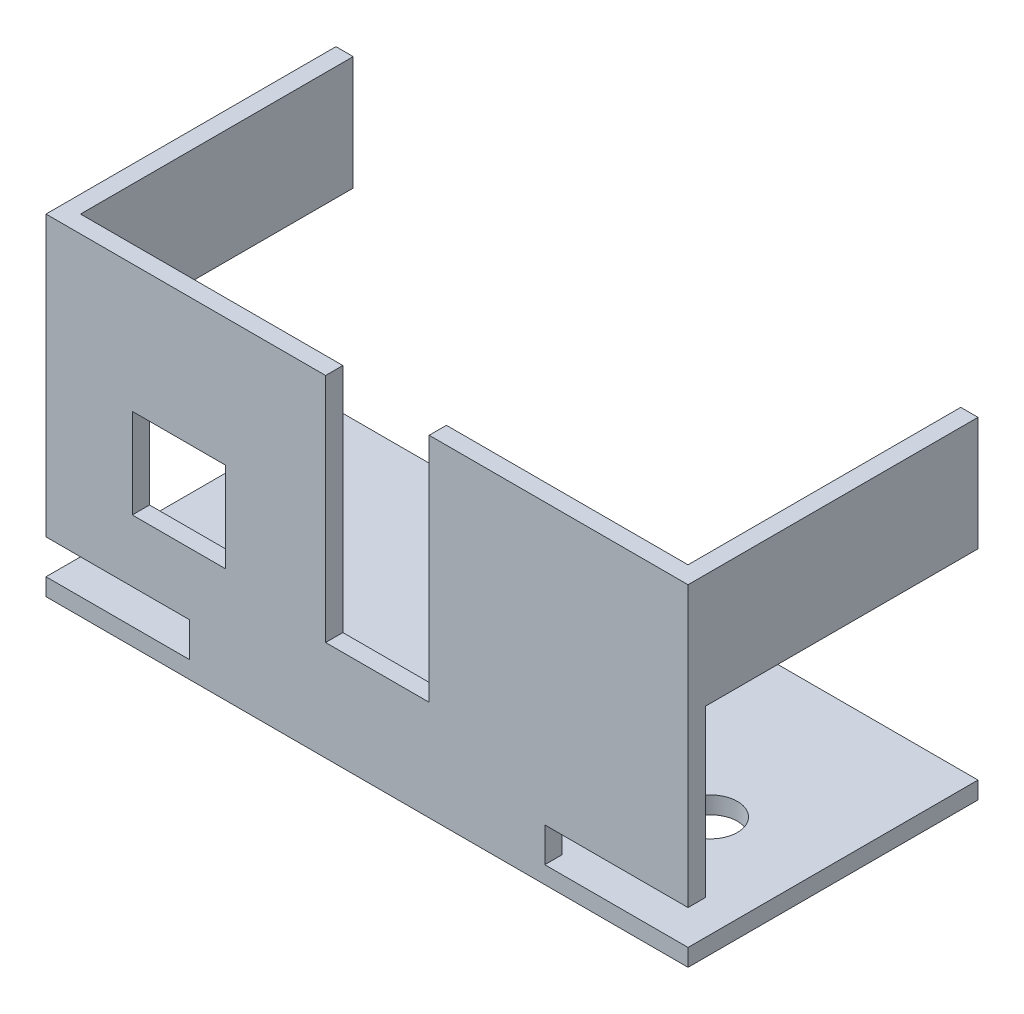
ISO-10303-21;
HEADER;
FILE_DESCRIPTION(('STEP AP214'),'2;1');
FILE_NAME('part.step','',(''),(''),'','','');
FILE_SCHEMA(('AUTOMOTIVE_DESIGN { 1 0 10303 214 1 1 1 1 }'));
ENDSEC;
DATA;
#1=APPLICATION_CONTEXT('core data for automotive mechanical design processes');
#2=APPLICATION_PROTOCOL_DEFINITION('international standard','automotive_design',2000,#1);
#3=PRODUCT_CONTEXT('',#1,'mechanical');
#4=PRODUCT('Part','Part','',(#3));
#5=PRODUCT_RELATED_PRODUCT_CATEGORY('part','',(#4));
#6=PRODUCT_DEFINITION_FORMATION('','',#4);
#7=PRODUCT_DEFINITION_CONTEXT('part definition',#1,'design');
#8=PRODUCT_DEFINITION('design','',#6,#7);
#9=PRODUCT_DEFINITION_SHAPE('','',#8);
#10=(LENGTH_UNIT() NAMED_UNIT(*) SI_UNIT(.MILLI.,.METRE.));
#11=(NAMED_UNIT(*) PLANE_ANGLE_UNIT() SI_UNIT($,.RADIAN.));
#12=(NAMED_UNIT(*) SI_UNIT($,.STERADIAN.) SOLID_ANGLE_UNIT());
#13=UNCERTAINTY_MEASURE_WITH_UNIT(LENGTH_MEASURE(1.E-05),#10,'distance_accuracy_value','');
#14=(GEOMETRIC_REPRESENTATION_CONTEXT(3) GLOBAL_UNCERTAINTY_ASSIGNED_CONTEXT((#13)) GLOBAL_UNIT_ASSIGNED_CONTEXT((#10,
#11,#12)) REPRESENTATION_CONTEXT('',''));
#15=CARTESIAN_POINT('',(0.,0.,0.));
#16=DIRECTION('',(0.,0.,1.));
#17=DIRECTION('',(1.,0.,0.));
#18=AXIS2_PLACEMENT_3D('',#15,#16,#17);
#19=CARTESIAN_POINT('',(-1.25,0.,-21.));
#20=DIRECTION('',(-1.,0.,0.));
#21=DIRECTION('',(0.,0.,1.));
#22=AXIS2_PLACEMENT_3D('',#19,#20,#21);
#23=PLANE('',#22);
#24=DIRECTION('',(0.,-1.,0.));
#25=VECTOR('',#24,1.);
#26=CARTESIAN_POINT('',(-1.25,0.,0.));
#27=LINE('',#26,#25);
#28=CARTESIAN_POINT('',(-1.25000000000002,1.25,0.));
#29=VERTEX_POINT('',#28);
#30=CARTESIAN_POINT('',(-1.25,0.,0.));
#31=VERTEX_POINT('',#30);
#32=EDGE_CURVE('E393',#29,#31,#27,.T.);
#33=ORIENTED_EDGE('',*,*,#32,.F.);
#34=DIRECTION('',(0.,0.,1.));
#35=VECTOR('',#34,1.);
#36=CARTESIAN_POINT('',(-1.25,1.25,-21.));
#37=LINE('',#36,#35);
#38=CARTESIAN_POINT('',(-1.25,1.25,-21.));
#39=VERTEX_POINT('',#38);
#40=EDGE_CURVE('E221',#39,#29,#37,.T.);
#41=ORIENTED_EDGE('',*,*,#40,.F.);
#42=DIRECTION('',(0.,-1.,0.));
#43=VECTOR('',#42,1.);
#44=CARTESIAN_POINT('',(-1.25,0.,-21.));
#45=LINE('',#44,#43);
#46=CARTESIAN_POINT('',(-1.25,0.,-21.));
#47=VERTEX_POINT('',#46);
#48=EDGE_CURVE('E378',#39,#47,#45,.T.);
#49=ORIENTED_EDGE('',*,*,#48,.T.);
#50=DIRECTION('',(0.,0.,1.));
#51=VECTOR('',#50,1.);
#52=CARTESIAN_POINT('',(-1.25,0.,-21.));
#53=LINE('',#52,#51);
#54=EDGE_CURVE('E41',#47,#31,#53,.T.);
#55=ORIENTED_EDGE('',*,*,#54,.T.);
#56=EDGE_LOOP('',(#33,#41,#49,#55));
#57=FACE_BOUND('',#56,.T.);
#58=ADVANCED_FACE('F33',(#57),#23,.T.);
#59=CARTESIAN_POINT('',(45.25,0.,-21.));
#60=DIRECTION('',(1.,0.,0.));
#61=DIRECTION('',(0.,0.,-1.));
#62=AXIS2_PLACEMENT_3D('',#59,#60,#61);
#63=PLANE('',#62);
#64=DIRECTION('',(0.,0.,1.));
#65=VECTOR('',#64,1.);
#66=CARTESIAN_POINT('',(45.25,1.25,-21.));
#67=LINE('',#66,#65);
#68=CARTESIAN_POINT('',(45.25,1.25,-21.));
#69=VERTEX_POINT('',#68);
#70=CARTESIAN_POINT('',(45.25,1.25,0.));
#71=VERTEX_POINT('',#70);
#72=EDGE_CURVE('E316',#69,#71,#67,.T.);
#73=ORIENTED_EDGE('',*,*,#72,.T.);
#74=DIRECTION('',(0.,1.,0.));
#75=VECTOR('',#74,1.);
#76=CARTESIAN_POINT('',(45.25,0.,0.));
#77=LINE('',#76,#75);
#78=CARTESIAN_POINT('',(45.25,0.,0.));
#79=VERTEX_POINT('',#78);
#80=EDGE_CURVE('E386',#79,#71,#77,.T.);
#81=ORIENTED_EDGE('',*,*,#80,.F.);
#82=DIRECTION('',(0.,0.,1.));
#83=VECTOR('',#82,1.);
#84=CARTESIAN_POINT('',(45.25,0.,-21.));
#85=LINE('',#84,#83);
#86=CARTESIAN_POINT('',(45.25,0.,-21.));
#87=VERTEX_POINT('',#86);
#88=EDGE_CURVE('E382',#87,#79,#85,.T.);
#89=ORIENTED_EDGE('',*,*,#88,.F.);
#90=DIRECTION('',(0.,1.,0.));
#91=VECTOR('',#90,1.);
#92=CARTESIAN_POINT('',(45.25,0.,-21.));
#93=LINE('',#92,#91);
#94=EDGE_CURVE('E371',#87,#69,#93,.T.);
#95=ORIENTED_EDGE('',*,*,#94,.T.);
#96=EDGE_LOOP('',(#73,#81,#89,#95));
#97=FACE_BOUND('',#96,.T.);
#98=ADVANCED_FACE('F410',(#97),#63,.T.);
#99=CARTESIAN_POINT('',(-1.25,0.,-21.));
#100=DIRECTION('',(0.,-1.,0.));
#101=DIRECTION('',(0.,0.,-1.));
#102=AXIS2_PLACEMENT_3D('',#99,#100,#101);
#103=PLANE('',#102);
#104=CARTESIAN_POINT('',(37.875,0.,-8.99999999999999));
#105=DIRECTION('',(0.,-1.,0.));
#106=DIRECTION('',(0.,0.,-1.));
#107=AXIS2_PLACEMENT_3D('',#104,#105,#106);
#108=CIRCLE('',#107,1.95);
#109=CARTESIAN_POINT('',(37.875,0.,-10.95));
#110=VERTEX_POINT('',#109);
#111=EDGE_CURVE('E258',#110,#110,#108,.T.);
#112=ORIENTED_EDGE('',*,*,#111,.F.);
#113=EDGE_LOOP('',(#112));
#114=FACE_BOUND('',#113,.T.);
#115=DIRECTION('',(1.,0.,0.));
#116=VECTOR('',#115,1.);
#117=CARTESIAN_POINT('',(-1.25,0.,0.));
#118=LINE('',#117,#116);
#119=EDGE_CURVE('E360',#31,#79,#118,.T.);
#120=ORIENTED_EDGE('',*,*,#119,.F.);
#121=ORIENTED_EDGE('',*,*,#54,.F.);
#122=DIRECTION('',(1.,0.,0.));
#123=VECTOR('',#122,1.);
#124=CARTESIAN_POINT('',(-1.25,0.,-21.));
#125=LINE('',#124,#123);
#126=EDGE_CURVE('E366',#47,#87,#125,.T.);
#127=ORIENTED_EDGE('',*,*,#126,.T.);
#128=ORIENTED_EDGE('',*,*,#88,.T.);
#129=EDGE_LOOP('',(#120,#121,#127,#128));
#130=FACE_BOUND('',#129,.T.);
#131=CARTESIAN_POINT('',(6.125,0.,-8.99999999999999));
#132=DIRECTION('',(0.,-1.,0.));
#133=DIRECTION('',(0.,0.,-1.));
#134=AXIS2_PLACEMENT_3D('',#131,#132,#133);
#135=CIRCLE('',#134,1.95);
#136=CARTESIAN_POINT('',(6.125,0.,-10.95));
#137=VERTEX_POINT('',#136);
#138=EDGE_CURVE('E261',#137,#137,#135,.F.);
#139=ORIENTED_EDGE('',*,*,#138,.T.);
#140=EDGE_LOOP('',(#139));
#141=FACE_BOUND('',#140,.T.);
#142=ADVANCED_FACE('F35',(#114,#130,#141),#103,.T.);
#143=CARTESIAN_POINT('',(-1.25,1.25,-21.));
#144=DIRECTION('',(0.,-1.,0.));
#145=DIRECTION('',(0.,0.,-1.));
#146=AXIS2_PLACEMENT_3D('',#143,#144,#145);
#147=PLANE('',#146);
#148=CARTESIAN_POINT('',(37.875,1.25,-8.99999999999999));
#149=DIRECTION('',(0.,-1.,0.));
#150=DIRECTION('',(0.,0.,-1.));
#151=AXIS2_PLACEMENT_3D('',#148,#149,#150);
#152=CIRCLE('',#151,1.95);
#153=CARTESIAN_POINT('',(37.875,1.25,-10.95));
#154=VERTEX_POINT('',#153);
#155=EDGE_CURVE('E255',#154,#154,#152,.F.);
#156=ORIENTED_EDGE('',*,*,#155,.F.);
#157=EDGE_LOOP('',(#156));
#158=FACE_BOUND('',#157,.T.);
#159=ORIENTED_EDGE('',*,*,#40,.T.);
#160=DIRECTION('',(1.,0.,0.));
#161=VECTOR('',#160,1.);
#162=CARTESIAN_POINT('',(-1.25000000000002,1.25,0.));
#163=LINE('',#162,#161);
#164=CARTESIAN_POINT('',(9.125,1.25000000000001,0.));
#165=VERTEX_POINT('',#164);
#166=EDGE_CURVE('E217',#29,#165,#163,.T.);
#167=ORIENTED_EDGE('',*,*,#166,.T.);
#168=DIRECTION('',(0.,0.,1.));
#169=VECTOR('',#168,1.);
#170=CARTESIAN_POINT('',(9.125,1.25000000000001,-11.9219550692458));
#171=LINE('',#170,#169);
#172=CARTESIAN_POINT('',(9.125,1.25000000000001,-1.25));
#173=VERTEX_POINT('',#172);
#174=EDGE_CURVE('E204',#173,#165,#171,.T.);
#175=ORIENTED_EDGE('',*,*,#174,.F.);
#176=DIRECTION('',(1.,0.,0.));
#177=VECTOR('',#176,1.);
#178=CARTESIAN_POINT('',(0.,1.25,-1.25));
#179=LINE('',#178,#177);
#180=CARTESIAN_POINT('',(34.875,1.25000000000001,-1.25));
#181=VERTEX_POINT('',#180);
#182=EDGE_CURVE('E341',#173,#181,#179,.T.);
#183=ORIENTED_EDGE('',*,*,#182,.T.);
#184=DIRECTION('',(0.,0.,1.));
#185=VECTOR('',#184,1.);
#186=CARTESIAN_POINT('',(34.875,1.25000000000001,-11.9219550692458));
#187=LINE('',#186,#185);
#188=CARTESIAN_POINT('',(34.875,1.25000000000001,0.));
#189=VERTEX_POINT('',#188);
#190=EDGE_CURVE('E242',#181,#189,#187,.T.);
#191=ORIENTED_EDGE('',*,*,#190,.T.);
#192=DIRECTION('',(1.,0.,0.));
#193=VECTOR('',#192,1.);
#194=CARTESIAN_POINT('',(45.25,1.25,0.));
#195=LINE('',#194,#193);
#196=EDGE_CURVE('E247',#189,#71,#195,.T.);
#197=ORIENTED_EDGE('',*,*,#196,.T.);
#198=ORIENTED_EDGE('',*,*,#72,.F.);
#199=DIRECTION('',(1.,0.,0.));
#200=VECTOR('',#199,1.);
#201=CARTESIAN_POINT('',(0.,1.25,-21.));
#202=LINE('',#201,#200);
#203=EDGE_CURVE('E347',#39,#69,#202,.T.);
#204=ORIENTED_EDGE('',*,*,#203,.F.);
#205=EDGE_LOOP('',(#159,#167,#175,#183,#191,#197,#198,#204));
#206=FACE_BOUND('',#205,.T.);
#207=CARTESIAN_POINT('',(6.125,1.25,-8.99999999999999));
#208=DIRECTION('',(0.,-1.,0.));
#209=DIRECTION('',(0.,0.,-1.));
#210=AXIS2_PLACEMENT_3D('',#207,#208,#209);
#211=CIRCLE('',#210,1.95);
#212=CARTESIAN_POINT('',(6.125,1.25,-10.95));
#213=VERTEX_POINT('',#212);
#214=EDGE_CURVE('E264',#213,#213,#211,.T.);
#215=ORIENTED_EDGE('',*,*,#214,.T.);
#216=EDGE_LOOP('',(#215));
#217=FACE_BOUND('',#216,.T.);
#218=ADVANCED_FACE('F218',(#158,#206,#217),#147,.F.);
#219=CARTESIAN_POINT('',(-1.25,24.,-21.));
#220=DIRECTION('',(0.,1.,0.));
#221=DIRECTION('',(0.,0.,1.));
#222=AXIS2_PLACEMENT_3D('',#219,#220,#221);
#223=PLANE('',#222);
#224=DIRECTION('',(0.,0.,1.));
#225=VECTOR('',#224,1.);
#226=CARTESIAN_POINT('',(19.,24.,-21.));
#227=LINE('',#226,#225);
#228=CARTESIAN_POINT('',(19.,24.,-1.25));
#229=VERTEX_POINT('',#228);
#230=CARTESIAN_POINT('',(19.,24.,0.));
#231=VERTEX_POINT('',#230);
#232=EDGE_CURVE('E285',#229,#231,#227,.T.);
#233=ORIENTED_EDGE('',*,*,#232,.F.);
#234=DIRECTION('',(-1.,0.,0.));
#235=VECTOR('',#234,1.);
#236=CARTESIAN_POINT('',(0.,24.,-1.25));
#237=LINE('',#236,#235);
#238=CARTESIAN_POINT('',(0.,24.,-1.25));
#239=VERTEX_POINT('',#238);
#240=EDGE_CURVE('E350',#229,#239,#237,.T.);
#241=ORIENTED_EDGE('',*,*,#240,.T.);
#242=DIRECTION('',(0.,0.,1.));
#243=VECTOR('',#242,1.);
#244=CARTESIAN_POINT('',(0.,24.,-21.));
#245=LINE('',#244,#243);
#246=CARTESIAN_POINT('',(0.,24.,-21.));
#247=VERTEX_POINT('',#246);
#248=EDGE_CURVE('E357',#247,#239,#245,.T.);
#249=ORIENTED_EDGE('',*,*,#248,.F.);
#250=DIRECTION('',(-1.,0.,0.));
#251=VECTOR('',#250,1.);
#252=CARTESIAN_POINT('',(-1.25,24.,-21.));
#253=LINE('',#252,#251);
#254=CARTESIAN_POINT('',(-1.25,24.,-21.));
#255=VERTEX_POINT('',#254);
#256=EDGE_CURVE('E374',#247,#255,#253,.T.);
#257=ORIENTED_EDGE('',*,*,#256,.T.);
#258=DIRECTION('',(0.,0.,1.));
#259=VECTOR('',#258,1.);
#260=CARTESIAN_POINT('',(-1.25,24.,-21.));
#261=LINE('',#260,#259);
#262=CARTESIAN_POINT('',(-1.25,24.,0.));
#263=VERTEX_POINT('',#262);
#264=EDGE_CURVE('E397',#255,#263,#261,.T.);
#265=ORIENTED_EDGE('',*,*,#264,.T.);
#266=DIRECTION('',(-1.,0.,0.));
#267=VECTOR('',#266,1.);
#268=CARTESIAN_POINT('',(-1.25,24.,0.));
#269=LINE('',#268,#267);
#270=EDGE_CURVE('E389',#231,#263,#269,.T.);
#271=ORIENTED_EDGE('',*,*,#270,.F.);
#272=EDGE_LOOP('',(#233,#241,#249,#257,#265,#271));
#273=FACE_BOUND('',#272,.T.);
#274=ADVANCED_FACE('F469',(#273),#223,.T.);
#275=CARTESIAN_POINT('',(0.,0.,-21.));
#276=DIRECTION('',(0.,0.,1.));
#277=DIRECTION('',(1.,0.,0.));
#278=AXIS2_PLACEMENT_3D('',#275,#276,#277);
#279=PLANE('',#278);
#280=DIRECTION('',(0.,-1.,0.));
#281=VECTOR('',#280,1.);
#282=CARTESIAN_POINT('',(0.,0.,-21.));
#283=LINE('',#282,#281);
#284=CARTESIAN_POINT('',(0.,15.75,-21.));
#285=VERTEX_POINT('',#284);
#286=EDGE_CURVE('E353',#247,#285,#283,.T.);
#287=ORIENTED_EDGE('',*,*,#286,.T.);
#288=DIRECTION('',(-1.,0.,0.));
#289=VECTOR('',#288,1.);
#290=CARTESIAN_POINT('',(45.25,15.75,-21.));
#291=LINE('',#290,#289);
#292=CARTESIAN_POINT('',(-1.25,15.75,-21.));
#293=VERTEX_POINT('',#292);
#294=EDGE_CURVE('E333',#285,#293,#291,.T.);
#295=ORIENTED_EDGE('',*,*,#294,.T.);
#296=EDGE_CURVE('E379',#255,#293,#45,.T.);
#297=ORIENTED_EDGE('',*,*,#296,.F.);
#298=ORIENTED_EDGE('',*,*,#256,.F.);
#299=EDGE_LOOP('',(#287,#295,#297,#298));
#300=FACE_BOUND('',#299,.T.);
#301=ADVANCED_FACE('F476',(#300),#279,.F.);
#302=CARTESIAN_POINT('',(45.25,15.75,-21.));
#303=VERTEX_POINT('',#302);
#304=CARTESIAN_POINT('',(45.25,24.,-21.));
#305=VERTEX_POINT('',#304);
#306=EDGE_CURVE('E369',#303,#305,#93,.T.);
#307=ORIENTED_EDGE('',*,*,#306,.F.);
#308=CARTESIAN_POINT('',(44.,15.75,-21.));
#309=VERTEX_POINT('',#308);
#310=EDGE_CURVE('E329',#303,#309,#291,.T.);
#311=ORIENTED_EDGE('',*,*,#310,.T.);
#312=DIRECTION('',(0.,1.,0.));
#313=VECTOR('',#312,1.);
#314=CARTESIAN_POINT('',(44.,0.,-21.));
#315=LINE('',#314,#313);
#316=CARTESIAN_POINT('',(44.,24.,-21.));
#317=VERTEX_POINT('',#316);
#318=EDGE_CURVE('E352',#309,#317,#315,.T.);
#319=ORIENTED_EDGE('',*,*,#318,.T.);
#320=EDGE_CURVE('E375',#305,#317,#253,.T.);
#321=ORIENTED_EDGE('',*,*,#320,.F.);
#322=EDGE_LOOP('',(#307,#311,#319,#321));
#323=FACE_BOUND('',#322,.T.);
#324=ADVANCED_FACE('F443',(#323),#279,.F.);
#325=DIRECTION('',(0.,0.,-1.));
#326=VECTOR('',#325,1.);
#327=CARTESIAN_POINT('',(26.5,24.,-21.));
#328=LINE('',#327,#326);
#329=CARTESIAN_POINT('',(26.5,24.,0.));
#330=VERTEX_POINT('',#329);
#331=CARTESIAN_POINT('',(26.5,24.,-1.25));
#332=VERTEX_POINT('',#331);
#333=EDGE_CURVE('E283',#330,#332,#328,.T.);
#334=ORIENTED_EDGE('',*,*,#333,.F.);
#335=CARTESIAN_POINT('',(45.25,24.,0.));
#336=VERTEX_POINT('',#335);
#337=EDGE_CURVE('E390',#336,#330,#269,.T.);
#338=ORIENTED_EDGE('',*,*,#337,.F.);
#339=DIRECTION('',(0.,0.,1.));
#340=VECTOR('',#339,1.);
#341=CARTESIAN_POINT('',(45.25,24.,-21.));
#342=LINE('',#341,#340);
#343=EDGE_CURVE('E400',#305,#336,#342,.T.);
#344=ORIENTED_EDGE('',*,*,#343,.F.);
#345=ORIENTED_EDGE('',*,*,#320,.T.);
#346=DIRECTION('',(0.,0.,1.));
#347=VECTOR('',#346,1.);
#348=CARTESIAN_POINT('',(44.,24.,-21.));
#349=LINE('',#348,#347);
#350=CARTESIAN_POINT('',(44.,24.,-1.25));
#351=VERTEX_POINT('',#350);
#352=EDGE_CURVE('E356',#317,#351,#349,.T.);
#353=ORIENTED_EDGE('',*,*,#352,.T.);
#354=EDGE_CURVE('E348',#351,#332,#237,.T.);
#355=ORIENTED_EDGE('',*,*,#354,.T.);
#356=EDGE_LOOP('',(#334,#338,#344,#345,#353,#355));
#357=FACE_BOUND('',#356,.T.);
#358=ADVANCED_FACE('F448',(#357),#223,.T.);
#359=DIRECTION('',(0.,0.,1.));
#360=VECTOR('',#359,1.);
#361=CARTESIAN_POINT('',(-1.25000000000002,3.75,-11.9219550692458));
#362=LINE('',#361,#360);
#363=CARTESIAN_POINT('',(-1.25000000000002,3.75,-1.25));
#364=VERTEX_POINT('',#363);
#365=CARTESIAN_POINT('',(-1.25000000000002,3.75,0.));
#366=VERTEX_POINT('',#365);
#367=EDGE_CURVE('E232',#364,#366,#362,.T.);
#368=ORIENTED_EDGE('',*,*,#367,.T.);
#369=EDGE_CURVE('E370',#263,#366,#27,.T.);
#370=ORIENTED_EDGE('',*,*,#369,.F.);
#371=ORIENTED_EDGE('',*,*,#264,.F.);
#372=ORIENTED_EDGE('',*,*,#296,.T.);
#373=DIRECTION('',(0.,0.,-1.));
#374=VECTOR('',#373,1.);
#375=CARTESIAN_POINT('',(-1.25,15.75,-21.));
#376=LINE('',#375,#374);
#377=CARTESIAN_POINT('',(-1.25,15.75,-1.25));
#378=VERTEX_POINT('',#377);
#379=EDGE_CURVE('E319',#378,#293,#376,.T.);
#380=ORIENTED_EDGE('',*,*,#379,.F.);
#381=DIRECTION('',(0.,1.,0.));
#382=VECTOR('',#381,1.);
#383=CARTESIAN_POINT('',(-1.25,1.25,-1.25));
#384=LINE('',#383,#382);
#385=EDGE_CURVE('E326',#364,#378,#384,.T.);
#386=ORIENTED_EDGE('',*,*,#385,.F.);
#387=EDGE_LOOP('',(#368,#370,#371,#372,#380,#386));
#388=FACE_BOUND('',#387,.T.);
#389=ADVANCED_FACE('F481',(#388),#23,.T.);
#390=DIRECTION('',(0.,0.,1.));
#391=VECTOR('',#390,1.);
#392=CARTESIAN_POINT('',(45.25,3.75,-11.9219550692458));
#393=LINE('',#392,#391);
#394=CARTESIAN_POINT('',(45.25,3.75,-1.25));
#395=VERTEX_POINT('',#394);
#396=CARTESIAN_POINT('',(45.25,3.75,0.));
#397=VERTEX_POINT('',#396);
#398=EDGE_CURVE('E250',#395,#397,#393,.T.);
#399=ORIENTED_EDGE('',*,*,#398,.F.);
#400=DIRECTION('',(0.,1.,0.));
#401=VECTOR('',#400,1.);
#402=CARTESIAN_POINT('',(45.25,1.25,-1.25));
#403=LINE('',#402,#401);
#404=CARTESIAN_POINT('',(45.25,15.75,-1.25));
#405=VERTEX_POINT('',#404);
#406=EDGE_CURVE('E318',#395,#405,#403,.T.);
#407=ORIENTED_EDGE('',*,*,#406,.T.);
#408=DIRECTION('',(0.,0.,-1.));
#409=VECTOR('',#408,1.);
#410=CARTESIAN_POINT('',(45.25,15.75,-21.));
#411=LINE('',#410,#409);
#412=EDGE_CURVE('E321',#405,#303,#411,.T.);
#413=ORIENTED_EDGE('',*,*,#412,.T.);
#414=ORIENTED_EDGE('',*,*,#306,.T.);
#415=ORIENTED_EDGE('',*,*,#343,.T.);
#416=EDGE_CURVE('E385',#397,#336,#77,.T.);
#417=ORIENTED_EDGE('',*,*,#416,.F.);
#418=EDGE_LOOP('',(#399,#407,#413,#414,#415,#417));
#419=FACE_BOUND('',#418,.T.);
#420=ADVANCED_FACE('F429',(#419),#63,.T.);
#421=ORIENTED_EDGE('',*,*,#48,.F.);
#422=ORIENTED_EDGE('',*,*,#203,.T.);
#423=ORIENTED_EDGE('',*,*,#94,.F.);
#424=ORIENTED_EDGE('',*,*,#126,.F.);
#425=EDGE_LOOP('',(#421,#422,#423,#424));
#426=FACE_BOUND('',#425,.T.);
#427=ADVANCED_FACE('F416',(#426),#279,.F.);
#428=CARTESIAN_POINT('',(0.,0.,0.));
#429=DIRECTION('',(0.,0.,1.));
#430=DIRECTION('',(1.,0.,0.));
#431=AXIS2_PLACEMENT_3D('',#428,#429,#430);
#432=PLANE('',#431);
#433=ORIENTED_EDGE('',*,*,#166,.F.);
#434=ORIENTED_EDGE('',*,*,#32,.T.);
#435=ORIENTED_EDGE('',*,*,#119,.T.);
#436=ORIENTED_EDGE('',*,*,#80,.T.);
#437=ORIENTED_EDGE('',*,*,#196,.F.);
#438=DIRECTION('',(0.,-1.,0.));
#439=VECTOR('',#438,1.);
#440=CARTESIAN_POINT('',(34.875,1.25000000000001,0.));
#441=LINE('',#440,#439);
#442=CARTESIAN_POINT('',(34.875,3.75000000000001,0.));
#443=VERTEX_POINT('',#442);
#444=EDGE_CURVE('E244',#443,#189,#441,.T.);
#445=ORIENTED_EDGE('',*,*,#444,.F.);
#446=DIRECTION('',(-1.,0.,0.));
#447=VECTOR('',#446,1.);
#448=CARTESIAN_POINT('',(45.25,3.75,0.));
#449=LINE('',#448,#447);
#450=EDGE_CURVE('E238',#397,#443,#449,.T.);
#451=ORIENTED_EDGE('',*,*,#450,.F.);
#452=ORIENTED_EDGE('',*,*,#416,.T.);
#453=ORIENTED_EDGE('',*,*,#337,.T.);
#454=DIRECTION('',(0.,1.,0.));
#455=VECTOR('',#454,1.);
#456=CARTESIAN_POINT('',(26.5,24.25,0.));
#457=LINE('',#456,#455);
#458=CARTESIAN_POINT('',(26.5,7.25,0.));
#459=VERTEX_POINT('',#458);
#460=EDGE_CURVE('E276',#459,#330,#457,.T.);
#461=ORIENTED_EDGE('',*,*,#460,.F.);
#462=DIRECTION('',(1.,0.,0.));
#463=VECTOR('',#462,1.);
#464=CARTESIAN_POINT('',(19.,7.25,0.));
#465=LINE('',#464,#463);
#466=CARTESIAN_POINT('',(19.,7.25,0.));
#467=VERTEX_POINT('',#466);
#468=EDGE_CURVE('E273',#467,#459,#465,.T.);
#469=ORIENTED_EDGE('',*,*,#468,.F.);
#470=DIRECTION('',(0.,-1.,0.));
#471=VECTOR('',#470,1.);
#472=CARTESIAN_POINT('',(19.,24.25,0.));
#473=LINE('',#472,#471);
#474=EDGE_CURVE('E267',#231,#467,#473,.T.);
#475=ORIENTED_EDGE('',*,*,#474,.F.);
#476=ORIENTED_EDGE('',*,*,#270,.T.);
#477=ORIENTED_EDGE('',*,*,#369,.T.);
#478=DIRECTION('',(-1.,0.,0.));
#479=VECTOR('',#478,1.);
#480=CARTESIAN_POINT('',(-1.25000000000002,3.75,0.));
#481=LINE('',#480,#479);
#482=CARTESIAN_POINT('',(9.125,3.75000000000001,0.));
#483=VERTEX_POINT('',#482);
#484=EDGE_CURVE('E214',#483,#366,#481,.T.);
#485=ORIENTED_EDGE('',*,*,#484,.F.);
#486=DIRECTION('',(0.,1.,0.));
#487=VECTOR('',#486,1.);
#488=CARTESIAN_POINT('',(9.125,1.25000000000001,0.));
#489=LINE('',#488,#487);
#490=EDGE_CURVE('E208',#165,#483,#489,.T.);
#491=ORIENTED_EDGE('',*,*,#490,.F.);
#492=EDGE_LOOP('',(#433,#434,#435,#436,#437,#445,#451,#452,#453,#461,#469,#475,#476,#477,#485,#491));
#493=FACE_BOUND('',#492,.T.);
#494=DIRECTION('',(0.,-1.,0.));
#495=VECTOR('',#494,1.);
#496=CARTESIAN_POINT('',(5.,14.75,0.));
#497=LINE('',#496,#495);
#498=CARTESIAN_POINT('',(5.,14.75,0.));
#499=VERTEX_POINT('',#498);
#500=CARTESIAN_POINT('',(5.,8.25,0.));
#501=VERTEX_POINT('',#500);
#502=EDGE_CURVE('E287',#499,#501,#497,.T.);
#503=ORIENTED_EDGE('',*,*,#502,.F.);
#504=DIRECTION('',(-1.,0.,0.));
#505=VECTOR('',#504,1.);
#506=CARTESIAN_POINT('',(5.,14.75,0.));
#507=LINE('',#506,#505);
#508=CARTESIAN_POINT('',(11.75,14.75,0.));
#509=VERTEX_POINT('',#508);
#510=EDGE_CURVE('E304',#509,#499,#507,.T.);
#511=ORIENTED_EDGE('',*,*,#510,.F.);
#512=DIRECTION('',(0.,1.,0.));
#513=VECTOR('',#512,1.);
#514=CARTESIAN_POINT('',(11.75,14.75,0.));
#515=LINE('',#514,#513);
#516=CARTESIAN_POINT('',(11.75,8.25,0.));
#517=VERTEX_POINT('',#516);
#518=EDGE_CURVE('E301',#517,#509,#515,.T.);
#519=ORIENTED_EDGE('',*,*,#518,.F.);
#520=DIRECTION('',(1.,0.,0.));
#521=VECTOR('',#520,1.);
#522=CARTESIAN_POINT('',(5.,8.25,0.));
#523=LINE('',#522,#521);
#524=EDGE_CURVE('E298',#501,#517,#523,.T.);
#525=ORIENTED_EDGE('',*,*,#524,.F.);
#526=EDGE_LOOP('',(#503,#511,#519,#525));
#527=FACE_BOUND('',#526,.T.);
#528=ADVANCED_FACE('F225',(#493,#527),#432,.T.);
#529=CARTESIAN_POINT('',(0.,0.,-21.));
#530=DIRECTION('',(-1.,0.,0.));
#531=DIRECTION('',(0.,0.,1.));
#532=AXIS2_PLACEMENT_3D('',#529,#530,#531);
#533=PLANE('',#532);
#534=DIRECTION('',(0.,-1.,0.));
#535=VECTOR('',#534,1.);
#536=CARTESIAN_POINT('',(0.,0.,-1.25));
#537=LINE('',#536,#535);
#538=CARTESIAN_POINT('',(0.,15.75,-1.25));
#539=VERTEX_POINT('',#538);
#540=EDGE_CURVE('E344',#239,#539,#537,.T.);
#541=ORIENTED_EDGE('',*,*,#540,.T.);
#542=DIRECTION('',(0.,0.,-1.));
#543=VECTOR('',#542,1.);
#544=CARTESIAN_POINT('',(0.,15.75,-21.));
#545=LINE('',#544,#543);
#546=EDGE_CURVE('E338',#539,#285,#545,.T.);
#547=ORIENTED_EDGE('',*,*,#546,.T.);
#548=ORIENTED_EDGE('',*,*,#286,.F.);
#549=ORIENTED_EDGE('',*,*,#248,.T.);
#550=EDGE_LOOP('',(#541,#547,#548,#549));
#551=FACE_BOUND('',#550,.T.);
#552=ADVANCED_FACE('F473',(#551),#533,.F.);
#553=CARTESIAN_POINT('',(44.,0.,-21.));
#554=DIRECTION('',(1.,0.,0.));
#555=DIRECTION('',(0.,0.,-1.));
#556=AXIS2_PLACEMENT_3D('',#553,#554,#555);
#557=PLANE('',#556);
#558=ORIENTED_EDGE('',*,*,#318,.F.);
#559=DIRECTION('',(0.,0.,1.));
#560=VECTOR('',#559,1.);
#561=CARTESIAN_POINT('',(44.,15.75,-21.));
#562=LINE('',#561,#560);
#563=CARTESIAN_POINT('',(44.,15.75,-1.25));
#564=VERTEX_POINT('',#563);
#565=EDGE_CURVE('E332',#309,#564,#562,.T.);
#566=ORIENTED_EDGE('',*,*,#565,.T.);
#567=DIRECTION('',(0.,1.,0.));
#568=VECTOR('',#567,1.);
#569=CARTESIAN_POINT('',(44.,0.,-1.25));
#570=LINE('',#569,#568);
#571=EDGE_CURVE('E343',#564,#351,#570,.T.);
#572=ORIENTED_EDGE('',*,*,#571,.T.);
#573=ORIENTED_EDGE('',*,*,#352,.F.);
#574=EDGE_LOOP('',(#558,#566,#572,#573));
#575=FACE_BOUND('',#574,.T.);
#576=ADVANCED_FACE('F531',(#575),#557,.F.);
#577=CARTESIAN_POINT('',(0.,0.,-1.25));
#578=DIRECTION('',(0.,0.,1.));
#579=DIRECTION('',(1.,0.,0.));
#580=AXIS2_PLACEMENT_3D('',#577,#578,#579);
#581=PLANE('',#580);
#582=DIRECTION('',(0.,-1.,0.));
#583=VECTOR('',#582,1.);
#584=CARTESIAN_POINT('',(9.125,1.25000000000001,-1.25));
#585=LINE('',#584,#583);
#586=CARTESIAN_POINT('',(9.125,3.75000000000001,-1.25));
#587=VERTEX_POINT('',#586);
#588=EDGE_CURVE('E211',#587,#173,#585,.T.);
#589=ORIENTED_EDGE('',*,*,#588,.F.);
#590=DIRECTION('',(1.,0.,0.));
#591=VECTOR('',#590,1.);
#592=CARTESIAN_POINT('',(-1.25000000000002,3.75,-1.25));
#593=LINE('',#592,#591);
#594=EDGE_CURVE('E235',#364,#587,#593,.T.);
#595=ORIENTED_EDGE('',*,*,#594,.F.);
#596=ORIENTED_EDGE('',*,*,#385,.T.);
#597=DIRECTION('',(-1.,0.,0.));
#598=VECTOR('',#597,1.);
#599=CARTESIAN_POINT('',(45.25,15.75,-1.25));
#600=LINE('',#599,#598);
#601=EDGE_CURVE('E324',#539,#378,#600,.T.);
#602=ORIENTED_EDGE('',*,*,#601,.F.);
#603=ORIENTED_EDGE('',*,*,#540,.F.);
#604=ORIENTED_EDGE('',*,*,#240,.F.);
#605=DIRECTION('',(0.,1.,0.));
#606=VECTOR('',#605,1.);
#607=CARTESIAN_POINT('',(19.,24.25,-1.25));
#608=LINE('',#607,#606);
#609=CARTESIAN_POINT('',(19.,7.25,-1.25));
#610=VERTEX_POINT('',#609);
#611=EDGE_CURVE('E268',#610,#229,#608,.T.);
#612=ORIENTED_EDGE('',*,*,#611,.F.);
#613=DIRECTION('',(-1.,0.,0.));
#614=VECTOR('',#613,1.);
#615=CARTESIAN_POINT('',(19.,7.25,-1.25));
#616=LINE('',#615,#614);
#617=CARTESIAN_POINT('',(26.5,7.25,-1.25));
#618=VERTEX_POINT('',#617);
#619=EDGE_CURVE('E270',#618,#610,#616,.T.);
#620=ORIENTED_EDGE('',*,*,#619,.F.);
#621=DIRECTION('',(0.,1.,0.));
#622=VECTOR('',#621,1.);
#623=CARTESIAN_POINT('',(26.5,0.,-1.25));
#624=LINE('',#623,#622);
#625=EDGE_CURVE('E11',#618,#332,#624,.T.);
#626=ORIENTED_EDGE('',*,*,#625,.T.);
#627=ORIENTED_EDGE('',*,*,#354,.F.);
#628=ORIENTED_EDGE('',*,*,#571,.F.);
#629=EDGE_CURVE('E334',#405,#564,#600,.T.);
#630=ORIENTED_EDGE('',*,*,#629,.F.);
#631=ORIENTED_EDGE('',*,*,#406,.F.);
#632=DIRECTION('',(1.,0.,0.));
#633=VECTOR('',#632,1.);
#634=CARTESIAN_POINT('',(45.25,3.75,-1.25));
#635=LINE('',#634,#633);
#636=CARTESIAN_POINT('',(34.875,3.75000000000001,-1.25));
#637=VERTEX_POINT('',#636);
#638=EDGE_CURVE('E241',#637,#395,#635,.T.);
#639=ORIENTED_EDGE('',*,*,#638,.F.);
#640=DIRECTION('',(0.,1.,0.));
#641=VECTOR('',#640,1.);
#642=CARTESIAN_POINT('',(34.875,1.25000000000001,-1.25));
#643=LINE('',#642,#641);
#644=EDGE_CURVE('E239',#181,#637,#643,.T.);
#645=ORIENTED_EDGE('',*,*,#644,.F.);
#646=ORIENTED_EDGE('',*,*,#182,.F.);
#647=EDGE_LOOP('',(#589,#595,#596,#602,#603,#604,#612,#620,#626,#627,#628,#630,#631,#639,#645,#646));
#648=FACE_BOUND('',#647,.T.);
#649=DIRECTION('',(1.,0.,0.));
#650=VECTOR('',#649,1.);
#651=CARTESIAN_POINT('',(5.,14.75,-1.25));
#652=LINE('',#651,#650);
#653=CARTESIAN_POINT('',(5.,14.75,-1.25));
#654=VERTEX_POINT('',#653);
#655=CARTESIAN_POINT('',(11.75,14.75,-1.25));
#656=VERTEX_POINT('',#655);
#657=EDGE_CURVE('E291',#654,#656,#652,.T.);
#658=ORIENTED_EDGE('',*,*,#657,.F.);
#659=DIRECTION('',(0.,1.,0.));
#660=VECTOR('',#659,1.);
#661=CARTESIAN_POINT('',(5.,14.75,-1.25));
#662=LINE('',#661,#660);
#663=CARTESIAN_POINT('',(5.,8.25,-1.25));
#664=VERTEX_POINT('',#663);
#665=EDGE_CURVE('E294',#664,#654,#662,.T.);
#666=ORIENTED_EDGE('',*,*,#665,.F.);
#667=DIRECTION('',(-1.,0.,0.));
#668=VECTOR('',#667,1.);
#669=CARTESIAN_POINT('',(5.,8.25,-1.25));
#670=LINE('',#669,#668);
#671=CARTESIAN_POINT('',(11.75,8.25,-1.25));
#672=VERTEX_POINT('',#671);
#673=EDGE_CURVE('E296',#672,#664,#670,.T.);
#674=ORIENTED_EDGE('',*,*,#673,.F.);
#675=DIRECTION('',(0.,-1.,0.));
#676=VECTOR('',#675,1.);
#677=CARTESIAN_POINT('',(11.75,14.75,-1.25));
#678=LINE('',#677,#676);
#679=EDGE_CURVE('E288',#656,#672,#678,.T.);
#680=ORIENTED_EDGE('',*,*,#679,.F.);
#681=EDGE_LOOP('',(#658,#666,#674,#680));
#682=FACE_BOUND('',#681,.T.);
#683=ADVANCED_FACE('F432',(#648,#682),#581,.F.);
#684=CARTESIAN_POINT('',(45.25,15.75,-21.));
#685=DIRECTION('',(0.,1.,0.));
#686=DIRECTION('',(0.,0.,1.));
#687=AXIS2_PLACEMENT_3D('',#684,#685,#686);
#688=PLANE('',#687);
#689=ORIENTED_EDGE('',*,*,#310,.F.);
#690=ORIENTED_EDGE('',*,*,#412,.F.);
#691=ORIENTED_EDGE('',*,*,#629,.T.);
#692=ORIENTED_EDGE('',*,*,#565,.F.);
#693=EDGE_LOOP('',(#689,#690,#691,#692));
#694=FACE_BOUND('',#693,.T.);
#695=ADVANCED_FACE('F438',(#694),#688,.F.);
#696=ORIENTED_EDGE('',*,*,#601,.T.);
#697=ORIENTED_EDGE('',*,*,#379,.T.);
#698=ORIENTED_EDGE('',*,*,#294,.F.);
#699=ORIENTED_EDGE('',*,*,#546,.F.);
#700=EDGE_LOOP('',(#696,#697,#698,#699));
#701=FACE_BOUND('',#700,.T.);
#702=ADVANCED_FACE('F489',(#701),#688,.F.);
#703=CARTESIAN_POINT('',(5.,14.75,-19.830904176062));
#704=DIRECTION('',(-1.,0.,0.));
#705=DIRECTION('',(0.,-1.,0.));
#706=AXIS2_PLACEMENT_3D('',#703,#704,#705);
#707=PLANE('',#706);
#708=ORIENTED_EDGE('',*,*,#665,.T.);
#709=DIRECTION('',(0.,0.,1.));
#710=VECTOR('',#709,1.);
#711=CARTESIAN_POINT('',(5.,14.75,-19.830904176062));
#712=LINE('',#711,#710);
#713=EDGE_CURVE('E292',#654,#499,#712,.T.);
#714=ORIENTED_EDGE('',*,*,#713,.T.);
#715=ORIENTED_EDGE('',*,*,#502,.T.);
#716=DIRECTION('',(0.,0.,1.));
#717=VECTOR('',#716,1.);
#718=CARTESIAN_POINT('',(5.,8.25,-19.830904176062));
#719=LINE('',#718,#717);
#720=EDGE_CURVE('E307',#664,#501,#719,.T.);
#721=ORIENTED_EDGE('',*,*,#720,.F.);
#722=EDGE_LOOP('',(#708,#714,#715,#721));
#723=FACE_BOUND('',#722,.T.);
#724=ADVANCED_FACE('F491',(#723),#707,.F.);
#725=CARTESIAN_POINT('',(5.,14.75,-19.830904176062));
#726=DIRECTION('',(0.,1.,0.));
#727=DIRECTION('',(0.,0.,1.));
#728=AXIS2_PLACEMENT_3D('',#725,#726,#727);
#729=PLANE('',#728);
#730=ORIENTED_EDGE('',*,*,#657,.T.);
#731=DIRECTION('',(0.,0.,1.));
#732=VECTOR('',#731,1.);
#733=CARTESIAN_POINT('',(11.75,14.75,-19.830904176062));
#734=LINE('',#733,#732);
#735=EDGE_CURVE('E309',#656,#509,#734,.T.);
#736=ORIENTED_EDGE('',*,*,#735,.T.);
#737=ORIENTED_EDGE('',*,*,#510,.T.);
#738=ORIENTED_EDGE('',*,*,#713,.F.);
#739=EDGE_LOOP('',(#730,#736,#737,#738));
#740=FACE_BOUND('',#739,.T.);
#741=ADVANCED_FACE('F497',(#740),#729,.F.);
#742=CARTESIAN_POINT('',(11.75,14.75,-19.830904176062));
#743=DIRECTION('',(1.,0.,0.));
#744=DIRECTION('',(0.,0.,-1.));
#745=AXIS2_PLACEMENT_3D('',#742,#743,#744);
#746=PLANE('',#745);
#747=ORIENTED_EDGE('',*,*,#679,.T.);
#748=DIRECTION('',(0.,0.,1.));
#749=VECTOR('',#748,1.);
#750=CARTESIAN_POINT('',(11.75,8.25,-19.830904176062));
#751=LINE('',#750,#749);
#752=EDGE_CURVE('E311',#672,#517,#751,.T.);
#753=ORIENTED_EDGE('',*,*,#752,.T.);
#754=ORIENTED_EDGE('',*,*,#518,.T.);
#755=ORIENTED_EDGE('',*,*,#735,.F.);
#756=EDGE_LOOP('',(#747,#753,#754,#755));
#757=FACE_BOUND('',#756,.T.);
#758=ADVANCED_FACE('F587',(#757),#746,.F.);
#759=CARTESIAN_POINT('',(5.,8.25,-19.830904176062));
#760=DIRECTION('',(0.,-1.,0.));
#761=DIRECTION('',(0.,0.,-1.));
#762=AXIS2_PLACEMENT_3D('',#759,#760,#761);
#763=PLANE('',#762);
#764=ORIENTED_EDGE('',*,*,#673,.T.);
#765=ORIENTED_EDGE('',*,*,#720,.T.);
#766=ORIENTED_EDGE('',*,*,#524,.T.);
#767=ORIENTED_EDGE('',*,*,#752,.F.);
#768=EDGE_LOOP('',(#764,#765,#766,#767));
#769=FACE_BOUND('',#768,.T.);
#770=ADVANCED_FACE('F597',(#769),#763,.F.);
#771=CARTESIAN_POINT('',(19.,24.25,-19.830904176062));
#772=DIRECTION('',(-1.,0.,0.));
#773=DIRECTION('',(0.,-1.,0.));
#774=AXIS2_PLACEMENT_3D('',#771,#772,#773);
#775=PLANE('',#774);
#776=ORIENTED_EDGE('',*,*,#232,.T.);
#777=ORIENTED_EDGE('',*,*,#474,.T.);
#778=DIRECTION('',(0.,0.,1.));
#779=VECTOR('',#778,1.);
#780=CARTESIAN_POINT('',(19.,7.25,-19.830904176062));
#781=LINE('',#780,#779);
#782=EDGE_CURVE('E278',#610,#467,#781,.T.);
#783=ORIENTED_EDGE('',*,*,#782,.F.);
#784=ORIENTED_EDGE('',*,*,#611,.T.);
#785=EDGE_LOOP('',(#776,#777,#783,#784));
#786=FACE_BOUND('',#785,.T.);
#787=ADVANCED_FACE('F462',(#786),#775,.F.);
#788=CARTESIAN_POINT('',(26.5,24.25,-19.830904176062));
#789=DIRECTION('',(1.,0.,0.));
#790=DIRECTION('',(0.,1.,0.));
#791=AXIS2_PLACEMENT_3D('',#788,#789,#790);
#792=PLANE('',#791);
#793=ORIENTED_EDGE('',*,*,#333,.T.);
#794=ORIENTED_EDGE('',*,*,#625,.F.);
#795=DIRECTION('',(0.,0.,1.));
#796=VECTOR('',#795,1.);
#797=CARTESIAN_POINT('',(26.5,7.25,-19.830904176062));
#798=LINE('',#797,#796);
#799=EDGE_CURVE('E271',#618,#459,#798,.T.);
#800=ORIENTED_EDGE('',*,*,#799,.T.);
#801=ORIENTED_EDGE('',*,*,#460,.T.);
#802=EDGE_LOOP('',(#793,#794,#800,#801));
#803=FACE_BOUND('',#802,.T.);
#804=ADVANCED_FACE('F454',(#803),#792,.F.);
#805=CARTESIAN_POINT('',(19.,7.25,-19.830904176062));
#806=DIRECTION('',(0.,-1.,0.));
#807=DIRECTION('',(0.,0.,-1.));
#808=AXIS2_PLACEMENT_3D('',#805,#806,#807);
#809=PLANE('',#808);
#810=ORIENTED_EDGE('',*,*,#619,.T.);
#811=ORIENTED_EDGE('',*,*,#782,.T.);
#812=ORIENTED_EDGE('',*,*,#468,.T.);
#813=ORIENTED_EDGE('',*,*,#799,.F.);
#814=EDGE_LOOP('',(#810,#811,#812,#813));
#815=FACE_BOUND('',#814,.T.);
#816=ADVANCED_FACE('F458',(#815),#809,.F.);
#817=CARTESIAN_POINT('',(6.125,6.76543289325507,-8.99999999999999));
#818=DIRECTION('',(0.,-1.,0.));
#819=DIRECTION('',(0.,0.,-1.));
#820=AXIS2_PLACEMENT_3D('',#817,#818,#819);
#821=CYLINDRICAL_SURFACE('',#820,1.95);
#822=ORIENTED_EDGE('',*,*,#214,.F.);
#823=EDGE_LOOP('',(#822));
#824=FACE_BOUND('',#823,.T.);
#825=ORIENTED_EDGE('',*,*,#138,.F.);
#826=EDGE_LOOP('',(#825));
#827=FACE_BOUND('',#826,.T.);
#828=ADVANCED_FACE('F632',(#824,#827),#821,.F.);
#829=CARTESIAN_POINT('',(37.875,6.76543289325507,-8.99999999999999));
#830=DIRECTION('',(0.,-1.,0.));
#831=DIRECTION('',(0.,0.,-1.));
#832=AXIS2_PLACEMENT_3D('',#829,#830,#831);
#833=CYLINDRICAL_SURFACE('',#832,1.95);
#834=ORIENTED_EDGE('',*,*,#155,.T.);
#835=EDGE_LOOP('',(#834));
#836=FACE_BOUND('',#835,.T.);
#837=ORIENTED_EDGE('',*,*,#111,.T.);
#838=EDGE_LOOP('',(#837));
#839=FACE_BOUND('',#838,.T.);
#840=ADVANCED_FACE('F649',(#836,#839),#833,.F.);
#841=CARTESIAN_POINT('',(34.875,1.25000000000001,-11.9219550692458));
#842=DIRECTION('',(-1.,0.,0.));
#843=DIRECTION('',(0.,0.,1.));
#844=AXIS2_PLACEMENT_3D('',#841,#842,#843);
#845=PLANE('',#844);
#846=ORIENTED_EDGE('',*,*,#644,.T.);
#847=DIRECTION('',(0.,0.,1.));
#848=VECTOR('',#847,1.);
#849=CARTESIAN_POINT('',(34.875,3.75000000000001,-11.9219550692458));
#850=LINE('',#849,#848);
#851=EDGE_CURVE('E56',#637,#443,#850,.T.);
#852=ORIENTED_EDGE('',*,*,#851,.T.);
#853=ORIENTED_EDGE('',*,*,#444,.T.);
#854=ORIENTED_EDGE('',*,*,#190,.F.);
#855=EDGE_LOOP('',(#846,#852,#853,#854));
#856=FACE_BOUND('',#855,.T.);
#857=ADVANCED_FACE('F422',(#856),#845,.F.);
#858=CARTESIAN_POINT('',(45.25,3.75,-11.9219550692458));
#859=DIRECTION('',(0.,1.,0.));
#860=DIRECTION('',(-1.,0.,0.));
#861=AXIS2_PLACEMENT_3D('',#858,#859,#860);
#862=PLANE('',#861);
#863=ORIENTED_EDGE('',*,*,#638,.T.);
#864=ORIENTED_EDGE('',*,*,#398,.T.);
#865=ORIENTED_EDGE('',*,*,#450,.T.);
#866=ORIENTED_EDGE('',*,*,#851,.F.);
#867=EDGE_LOOP('',(#863,#864,#865,#866));
#868=FACE_BOUND('',#867,.T.);
#869=ADVANCED_FACE('F425',(#868),#862,.F.);
#870=CARTESIAN_POINT('',(-1.25000000000002,3.75,-11.9219550692458));
#871=DIRECTION('',(0.,1.,0.));
#872=DIRECTION('',(-1.,0.,0.));
#873=AXIS2_PLACEMENT_3D('',#870,#871,#872);
#874=PLANE('',#873);
#875=ORIENTED_EDGE('',*,*,#594,.T.);
#876=DIRECTION('',(0.,0.,1.));
#877=VECTOR('',#876,1.);
#878=CARTESIAN_POINT('',(9.125,3.75000000000001,-11.9219550692458));
#879=LINE('',#878,#877);
#880=EDGE_CURVE('E48',#587,#483,#879,.T.);
#881=ORIENTED_EDGE('',*,*,#880,.T.);
#882=ORIENTED_EDGE('',*,*,#484,.T.);
#883=ORIENTED_EDGE('',*,*,#367,.F.);
#884=EDGE_LOOP('',(#875,#881,#882,#883));
#885=FACE_BOUND('',#884,.T.);
#886=ADVANCED_FACE('F486',(#885),#874,.F.);
#887=CARTESIAN_POINT('',(9.125,1.25000000000001,-11.9219550692458));
#888=DIRECTION('',(1.,0.,0.));
#889=DIRECTION('',(0.,0.,-1.));
#890=AXIS2_PLACEMENT_3D('',#887,#888,#889);
#891=PLANE('',#890);
#892=ORIENTED_EDGE('',*,*,#588,.T.);
#893=ORIENTED_EDGE('',*,*,#174,.T.);
#894=ORIENTED_EDGE('',*,*,#490,.T.);
#895=ORIENTED_EDGE('',*,*,#880,.F.);
#896=EDGE_LOOP('',(#892,#893,#894,#895));
#897=FACE_BOUND('',#896,.T.);
#898=ADVANCED_FACE('F206',(#897),#891,.F.);
#899=CLOSED_SHELL('',(#58,#98,#142,#218,#274,#301,#324,#358,#389,#420,#427,#528,#552,#576,#683,
#695,#702,#724,#741,#758,#770,#787,#804,#816,#828,#840,#857,#869,#886,#898));
#900=MANIFOLD_SOLID_BREP('B2',#899);
#901=ADVANCED_BREP_SHAPE_REPRESENTATION('',(#18,#900),#14);
#902=SHAPE_DEFINITION_REPRESENTATION(#9,#901);
ENDSEC;
END-ISO-10303-21;
